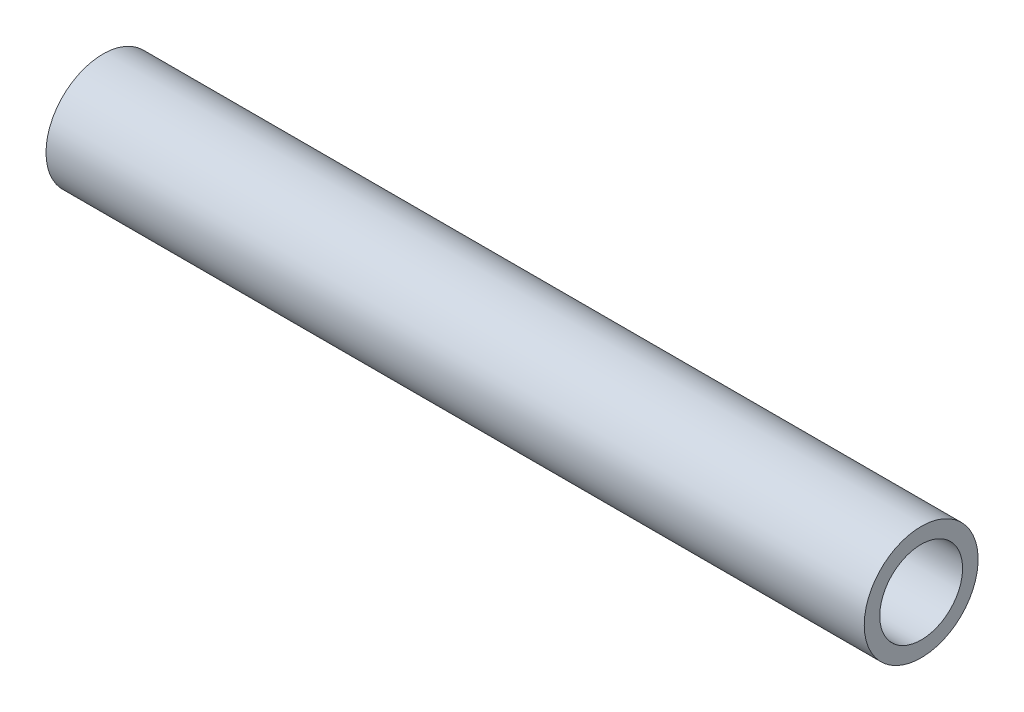
ISO-10303-21;
HEADER;
FILE_DESCRIPTION(('STEP AP214'),'2;1');
FILE_NAME('part.step','',(''),(''),'','','');
FILE_SCHEMA(('AUTOMOTIVE_DESIGN { 1 0 10303 214 1 1 1 1 }'));
ENDSEC;
DATA;
#1=APPLICATION_CONTEXT('core data for automotive mechanical design processes');
#2=APPLICATION_PROTOCOL_DEFINITION('international standard','automotive_design',2000,#1);
#3=PRODUCT_CONTEXT('',#1,'mechanical');
#4=PRODUCT('Part','Part','',(#3));
#5=PRODUCT_RELATED_PRODUCT_CATEGORY('part','',(#4));
#6=PRODUCT_DEFINITION_FORMATION('','',#4);
#7=PRODUCT_DEFINITION_CONTEXT('part definition',#1,'design');
#8=PRODUCT_DEFINITION('design','',#6,#7);
#9=PRODUCT_DEFINITION_SHAPE('','',#8);
#10=(LENGTH_UNIT() NAMED_UNIT(*) SI_UNIT(.MILLI.,.METRE.));
#11=(NAMED_UNIT(*) PLANE_ANGLE_UNIT() SI_UNIT($,.RADIAN.));
#12=(NAMED_UNIT(*) SI_UNIT($,.STERADIAN.) SOLID_ANGLE_UNIT());
#13=UNCERTAINTY_MEASURE_WITH_UNIT(LENGTH_MEASURE(1.E-05),#10,'distance_accuracy_value','');
#14=(GEOMETRIC_REPRESENTATION_CONTEXT(3) GLOBAL_UNCERTAINTY_ASSIGNED_CONTEXT((#13)) GLOBAL_UNIT_ASSIGNED_CONTEXT((#10,
#11,#12)) REPRESENTATION_CONTEXT('',''));
#15=CARTESIAN_POINT('',(0.,0.,0.));
#16=DIRECTION('',(0.,0.,1.));
#17=DIRECTION('',(1.,0.,0.));
#18=AXIS2_PLACEMENT_3D('',#15,#16,#17);
#19=CARTESIAN_POINT('',(239.999999999998,0.,0.));
#20=DIRECTION('',(0.999999999999997,0.,0.));
#21=DIRECTION('',(0.,0.,-0.999999999999997));
#22=AXIS2_PLACEMENT_3D('',#19,#20,#21);
#23=PLANE('',#22);
#24=CARTESIAN_POINT('',(239.999999999998,0.,0.));
#25=DIRECTION('',(0.999999999999997,0.,0.));
#26=DIRECTION('',(0.,0.,-0.999999999999997));
#27=AXIS2_PLACEMENT_3D('',#24,#25,#26);
#28=CIRCLE('',#27,16.7);
#29=CARTESIAN_POINT('',(239.999999999998,1.01779695782511E-13,16.6999999999999));
#30=VERTEX_POINT('',#29);
#31=EDGE_CURVE('E10',#30,#30,#28,.T.);
#32=ORIENTED_EDGE('',*,*,#31,.T.);
#33=EDGE_LOOP('',(#32));
#34=FACE_BOUND('',#33,.T.);
#35=CARTESIAN_POINT('',(239.999999999998,0.,0.));
#36=DIRECTION('',(0.999999999999997,0.,0.));
#37=DIRECTION('',(0.,0.,-0.999999999999997));
#38=AXIS2_PLACEMENT_3D('',#35,#36,#37);
#39=CIRCLE('',#38,12.15);
#40=CARTESIAN_POINT('',(239.999999999998,1.00516817092E-13,12.1499999999999));
#41=VERTEX_POINT('',#40);
#42=EDGE_CURVE('E39',#41,#41,#39,.T.);
#43=ORIENTED_EDGE('',*,*,#42,.F.);
#44=EDGE_LOOP('',(#43));
#45=FACE_BOUND('',#44,.T.);
#46=ADVANCED_FACE('F28',(#34,#45),#23,.T.);
#47=CARTESIAN_POINT('',(0.,0.,0.));
#48=DIRECTION('',(0.999999999999997,0.,0.));
#49=DIRECTION('',(0.,0.,-0.999999999999997));
#50=AXIS2_PLACEMENT_3D('',#47,#48,#49);
#51=PLANE('',#50);
#52=CARTESIAN_POINT('',(0.,0.,0.));
#53=DIRECTION('',(0.999999999999997,0.,0.));
#54=DIRECTION('',(0.,0.,-0.999999999999997));
#55=AXIS2_PLACEMENT_3D('',#52,#53,#54);
#56=CIRCLE('',#55,16.7);
#57=CARTESIAN_POINT('',(0.,1.01779695782513E-13,16.6999999999999));
#58=VERTEX_POINT('',#57);
#59=EDGE_CURVE('E32',#58,#58,#56,.T.);
#60=ORIENTED_EDGE('',*,*,#59,.F.);
#61=EDGE_LOOP('',(#60));
#62=FACE_BOUND('',#61,.T.);
#63=CARTESIAN_POINT('',(0.,0.,0.));
#64=DIRECTION('',(0.999999999999997,0.,0.));
#65=DIRECTION('',(0.,0.,-0.999999999999997));
#66=AXIS2_PLACEMENT_3D('',#63,#64,#65);
#67=CIRCLE('',#66,12.15);
#68=CARTESIAN_POINT('',(0.,1.00516817092002E-13,12.1499999999999));
#69=VERTEX_POINT('',#68);
#70=EDGE_CURVE('E41',#69,#69,#67,.T.);
#71=ORIENTED_EDGE('',*,*,#70,.T.);
#72=EDGE_LOOP('',(#71));
#73=FACE_BOUND('',#72,.T.);
#74=ADVANCED_FACE('F51',(#62,#73),#51,.F.);
#75=CARTESIAN_POINT('',(239.999999999998,0.,0.));
#76=DIRECTION('',(-0.999999999999997,0.,0.));
#77=DIRECTION('',(0.,0.,0.999999999999997));
#78=AXIS2_PLACEMENT_3D('',#75,#76,#77);
#79=CYLINDRICAL_SURFACE('',#78,16.7);
#80=CARTESIAN_POINT('',(239.999999999998,1.01779695782511E-13,16.6999999999999));
#81=CARTESIAN_POINT('',(237.499999999998,1.01779695782511E-13,16.6999999999999));
#82=CARTESIAN_POINT('',(234.999999999998,1.01779695782511E-13,16.6999999999999));
#83=CARTESIAN_POINT('',(229.999999999999,1.01779695782511E-13,16.6999999999999));
#84=CARTESIAN_POINT('',(227.499999999999,1.01779695782511E-13,16.6999999999999));
#85=CARTESIAN_POINT('',(222.499999999999,1.01779695782511E-13,16.6999999999999));
#86=CARTESIAN_POINT('',(219.999999999999,1.01779695782511E-13,16.6999999999999));
#87=CARTESIAN_POINT('',(214.999999999999,1.01779695782511E-13,16.6999999999999));
#88=CARTESIAN_POINT('',(212.499999999999,1.01779695782511E-13,16.6999999999999));
#89=CARTESIAN_POINT('',(207.499999999999,1.01779695782511E-13,16.6999999999999));
#90=CARTESIAN_POINT('',(204.999999999999,1.01779695782511E-13,16.6999999999999));
#91=CARTESIAN_POINT('',(199.999999999999,1.01779695782512E-13,16.6999999999999));
#92=CARTESIAN_POINT('',(197.499999999999,1.01779695782512E-13,16.6999999999999));
#93=CARTESIAN_POINT('',(192.499999999999,1.01779695782512E-13,16.6999999999999));
#94=CARTESIAN_POINT('',(189.999999999999,1.01779695782512E-13,16.6999999999999));
#95=CARTESIAN_POINT('',(184.999999999999,1.01779695782512E-13,16.6999999999999));
#96=CARTESIAN_POINT('',(182.499999999999,1.01779695782512E-13,16.6999999999999));
#97=CARTESIAN_POINT('',(177.499999999999,1.01779695782512E-13,16.6999999999999));
#98=CARTESIAN_POINT('',(174.999999999999,1.01779695782512E-13,16.6999999999999));
#99=CARTESIAN_POINT('',(169.999999999999,1.01779695782512E-13,16.6999999999999));
#100=CARTESIAN_POINT('',(167.499999999999,1.01779695782512E-13,16.6999999999999));
#101=CARTESIAN_POINT('',(162.499999999999,1.01779695782512E-13,16.6999999999999));
#102=CARTESIAN_POINT('',(159.999999999999,1.01779695782512E-13,16.6999999999999));
#103=CARTESIAN_POINT('',(154.999999999999,1.01779695782512E-13,16.6999999999999));
#104=CARTESIAN_POINT('',(152.499999999999,1.01779695782512E-13,16.6999999999999));
#105=CARTESIAN_POINT('',(147.499999999999,1.01779695782512E-13,16.6999999999999));
#106=CARTESIAN_POINT('',(144.999999999999,1.01779695782512E-13,16.6999999999999));
#107=CARTESIAN_POINT('',(139.999999999999,1.01779695782512E-13,16.6999999999999));
#108=CARTESIAN_POINT('',(137.499999999999,1.01779695782512E-13,16.6999999999999));
#109=CARTESIAN_POINT('',(132.499999999999,1.01779695782512E-13,16.6999999999999));
#110=CARTESIAN_POINT('',(129.999999999999,1.01779695782512E-13,16.6999999999999));
#111=CARTESIAN_POINT('',(124.999999999999,1.01779695782512E-13,16.6999999999999));
#112=CARTESIAN_POINT('',(122.499999999999,1.01779695782512E-13,16.6999999999999));
#113=CARTESIAN_POINT('',(117.499999999999,1.01779695782512E-13,16.6999999999999));
#114=CARTESIAN_POINT('',(114.999999999999,1.01779695782512E-13,16.6999999999999));
#115=CARTESIAN_POINT('',(109.999999999999,1.01779695782512E-13,16.6999999999999));
#116=CARTESIAN_POINT('',(107.499999999999,1.01779695782512E-13,16.6999999999999));
#117=CARTESIAN_POINT('',(102.499999999999,1.01779695782512E-13,16.6999999999999));
#118=CARTESIAN_POINT('',(99.9999999999993,1.01779695782512E-13,16.6999999999999));
#119=CARTESIAN_POINT('',(94.9999999999993,1.01779695782512E-13,16.6999999999999));
#120=CARTESIAN_POINT('',(92.4999999999994,1.01779695782512E-13,16.6999999999999));
#121=CARTESIAN_POINT('',(87.4999999999994,1.01779695782512E-13,16.6999999999999));
#122=CARTESIAN_POINT('',(84.9999999999994,1.01779695782512E-13,16.6999999999999));
#123=CARTESIAN_POINT('',(79.9999999999994,1.01779695782512E-13,16.6999999999999));
#124=CARTESIAN_POINT('',(77.4999999999994,1.01779695782512E-13,16.6999999999999));
#125=CARTESIAN_POINT('',(72.4999999999995,1.01779695782512E-13,16.6999999999999));
#126=CARTESIAN_POINT('',(69.9999999999995,1.01779695782512E-13,16.6999999999999));
#127=CARTESIAN_POINT('',(64.9999999999995,1.01779695782512E-13,16.6999999999999));
#128=CARTESIAN_POINT('',(62.4999999999996,1.01779695782512E-13,16.6999999999999));
#129=CARTESIAN_POINT('',(57.4999999999996,1.01779695782513E-13,16.6999999999999));
#130=CARTESIAN_POINT('',(54.9999999999996,1.01779695782513E-13,16.6999999999999));
#131=CARTESIAN_POINT('',(49.9999999999997,1.01779695782513E-13,16.6999999999999));
#132=CARTESIAN_POINT('',(47.4999999999997,1.01779695782513E-13,16.6999999999999));
#133=CARTESIAN_POINT('',(42.4999999999997,1.01779695782513E-13,16.6999999999999));
#134=CARTESIAN_POINT('',(39.9999999999997,1.01779695782513E-13,16.6999999999999));
#135=CARTESIAN_POINT('',(34.9999999999997,1.01779695782513E-13,16.6999999999999));
#136=CARTESIAN_POINT('',(32.4999999999998,1.01779695782513E-13,16.6999999999999));
#137=CARTESIAN_POINT('',(27.4999999999998,1.01779695782513E-13,16.6999999999999));
#138=CARTESIAN_POINT('',(24.9999999999998,1.01779695782513E-13,16.6999999999999));
#139=CARTESIAN_POINT('',(19.9999999999998,1.01779695782513E-13,16.6999999999999));
#140=CARTESIAN_POINT('',(17.4999999999999,1.01779695782513E-13,16.6999999999999));
#141=CARTESIAN_POINT('',(12.4999999999999,1.01779695782513E-13,16.6999999999999));
#142=CARTESIAN_POINT('',(9.99999999999991,1.01779695782513E-13,16.6999999999999));
#143=CARTESIAN_POINT('',(4.99999999999994,1.01779695782513E-13,16.6999999999999));
#144=CARTESIAN_POINT('',(2.49999999999996,1.01779695782513E-13,16.6999999999999));
#145=CARTESIAN_POINT('',(0.,1.01779695782513E-13,16.6999999999999));
#146=B_SPLINE_CURVE_WITH_KNOTS('',3,(#80,#81,#82,#83,#84,#85,#86,#87,#88,#89,#90,#91,#92,#93,
#94,#95,#96,#97,#98,#99,#100,#101,#102,#103,#104,#105,#106,#107,#108,#109,#110,#111,#112,#113,
#114,#115,#116,#117,#118,#119,#120,#121,#122,#123,#124,#125,#126,#127,#128,#129,#130,#131,#132,
#133,#134,#135,#136,#137,#138,#139,#140,#141,#142,#143,#144,#145),.UNSPECIFIED.,.F.,.F.,(4,2,2,
2,2,2,2,2,2,2,2,2,2,2,2,2,2,2,2,2,2,2,2,2,2,2,2,2,2,2,2,2,4),(0.,7.49999999999992,
14.9999999999999,22.4999999999998,29.9999999999998,37.4999999999997,44.9999999999997,
52.4999999999996,59.9999999999996,67.4999999999995,74.9999999999995,82.4999999999995,
89.9999999999994,97.4999999999993,104.999999999999,112.499999999999,119.999999999999,
127.499999999999,134.999999999999,142.499999999999,149.999999999999,157.499999999999,
164.999999999999,172.499999999999,179.999999999999,187.499999999999,194.999999999999,
202.499999999999,209.999999999999,217.499999999999,224.999999999999,232.499999999998,
239.999999999998),.UNSPECIFIED.);
#147=EDGE_CURVE('BSEAM30',#30,#58,#146,.T.);
#148=ORIENTED_EDGE('',*,*,#31,.F.);
#149=ORIENTED_EDGE('',*,*,#59,.T.);
#150=ORIENTED_EDGE('',*,*,#147,.T.);
#151=ORIENTED_EDGE('',*,*,#147,.F.);
#152=EDGE_LOOP('',(#148,#150,#149,#151));
#153=FACE_BOUND('',#152,.T.);
#154=ADVANCED_FACE('F30',(#153),#79,.T.);
#155=CARTESIAN_POINT('',(239.999999999998,0.,0.));
#156=DIRECTION('',(-0.999999999999997,0.,0.));
#157=DIRECTION('',(0.,0.,0.999999999999997));
#158=AXIS2_PLACEMENT_3D('',#155,#156,#157);
#159=CYLINDRICAL_SURFACE('',#158,12.15);
#160=CARTESIAN_POINT('',(239.999999999998,1.00516817092E-13,12.1499999999999));
#161=CARTESIAN_POINT('',(237.499999999998,1.00516817092E-13,12.1499999999999));
#162=CARTESIAN_POINT('',(234.999999999998,1.00516817092E-13,12.1499999999999));
#163=CARTESIAN_POINT('',(229.999999999999,1.00516817092E-13,12.1499999999999));
#164=CARTESIAN_POINT('',(227.499999999999,1.00516817092E-13,12.1499999999999));
#165=CARTESIAN_POINT('',(222.499999999999,1.00516817092E-13,12.1499999999999));
#166=CARTESIAN_POINT('',(219.999999999999,1.00516817092E-13,12.1499999999999));
#167=CARTESIAN_POINT('',(214.999999999999,1.00516817092E-13,12.1499999999999));
#168=CARTESIAN_POINT('',(212.499999999999,1.00516817092E-13,12.1499999999999));
#169=CARTESIAN_POINT('',(207.499999999999,1.00516817092E-13,12.1499999999999));
#170=CARTESIAN_POINT('',(204.999999999999,1.00516817092E-13,12.1499999999999));
#171=CARTESIAN_POINT('',(199.999999999999,1.00516817092E-13,12.1499999999999));
#172=CARTESIAN_POINT('',(197.499999999999,1.00516817092E-13,12.1499999999999));
#173=CARTESIAN_POINT('',(192.499999999999,1.00516817092E-13,12.1499999999999));
#174=CARTESIAN_POINT('',(189.999999999999,1.00516817092E-13,12.1499999999999));
#175=CARTESIAN_POINT('',(184.999999999999,1.00516817092001E-13,12.1499999999999));
#176=CARTESIAN_POINT('',(182.499999999999,1.00516817092001E-13,12.1499999999999));
#177=CARTESIAN_POINT('',(177.499999999999,1.00516817092001E-13,12.1499999999999));
#178=CARTESIAN_POINT('',(174.999999999999,1.00516817092001E-13,12.1499999999999));
#179=CARTESIAN_POINT('',(169.999999999999,1.00516817092001E-13,12.1499999999999));
#180=CARTESIAN_POINT('',(167.499999999999,1.00516817092001E-13,12.1499999999999));
#181=CARTESIAN_POINT('',(162.499999999999,1.00516817092001E-13,12.1499999999999));
#182=CARTESIAN_POINT('',(159.999999999999,1.00516817092001E-13,12.1499999999999));
#183=CARTESIAN_POINT('',(154.999999999999,1.00516817092001E-13,12.1499999999999));
#184=CARTESIAN_POINT('',(152.499999999999,1.00516817092001E-13,12.1499999999999));
#185=CARTESIAN_POINT('',(147.499999999999,1.00516817092001E-13,12.1499999999999));
#186=CARTESIAN_POINT('',(144.999999999999,1.00516817092001E-13,12.1499999999999));
#187=CARTESIAN_POINT('',(139.999999999999,1.00516817092001E-13,12.1499999999999));
#188=CARTESIAN_POINT('',(137.499999999999,1.00516817092001E-13,12.1499999999999));
#189=CARTESIAN_POINT('',(132.499999999999,1.00516817092001E-13,12.1499999999999));
#190=CARTESIAN_POINT('',(129.999999999999,1.00516817092001E-13,12.1499999999999));
#191=CARTESIAN_POINT('',(124.999999999999,1.00516817092001E-13,12.1499999999999));
#192=CARTESIAN_POINT('',(122.499999999999,1.00516817092001E-13,12.1499999999999));
#193=CARTESIAN_POINT('',(117.499999999999,1.00516817092001E-13,12.1499999999999));
#194=CARTESIAN_POINT('',(114.999999999999,1.00516817092001E-13,12.1499999999999));
#195=CARTESIAN_POINT('',(109.999999999999,1.00516817092001E-13,12.1499999999999));
#196=CARTESIAN_POINT('',(107.499999999999,1.00516817092001E-13,12.1499999999999));
#197=CARTESIAN_POINT('',(102.499999999999,1.00516817092001E-13,12.1499999999999));
#198=CARTESIAN_POINT('',(99.9999999999993,1.00516817092001E-13,12.1499999999999));
#199=CARTESIAN_POINT('',(94.9999999999993,1.00516817092001E-13,12.1499999999999));
#200=CARTESIAN_POINT('',(92.4999999999994,1.00516817092001E-13,12.1499999999999));
#201=CARTESIAN_POINT('',(87.4999999999994,1.00516817092001E-13,12.1499999999999));
#202=CARTESIAN_POINT('',(84.9999999999994,1.00516817092001E-13,12.1499999999999));
#203=CARTESIAN_POINT('',(79.9999999999994,1.00516817092001E-13,12.1499999999999));
#204=CARTESIAN_POINT('',(77.4999999999994,1.00516817092001E-13,12.1499999999999));
#205=CARTESIAN_POINT('',(72.4999999999995,1.00516817092001E-13,12.1499999999999));
#206=CARTESIAN_POINT('',(69.9999999999995,1.00516817092001E-13,12.1499999999999));
#207=CARTESIAN_POINT('',(64.9999999999995,1.00516817092001E-13,12.1499999999999));
#208=CARTESIAN_POINT('',(62.4999999999996,1.00516817092001E-13,12.1499999999999));
#209=CARTESIAN_POINT('',(57.4999999999996,1.00516817092001E-13,12.1499999999999));
#210=CARTESIAN_POINT('',(54.9999999999996,1.00516817092001E-13,12.1499999999999));
#211=CARTESIAN_POINT('',(49.9999999999997,1.00516817092001E-13,12.1499999999999));
#212=CARTESIAN_POINT('',(47.4999999999997,1.00516817092001E-13,12.1499999999999));
#213=CARTESIAN_POINT('',(42.4999999999997,1.00516817092002E-13,12.1499999999999));
#214=CARTESIAN_POINT('',(39.9999999999997,1.00516817092002E-13,12.1499999999999));
#215=CARTESIAN_POINT('',(34.9999999999997,1.00516817092002E-13,12.1499999999999));
#216=CARTESIAN_POINT('',(32.4999999999998,1.00516817092002E-13,12.1499999999999));
#217=CARTESIAN_POINT('',(27.4999999999998,1.00516817092002E-13,12.1499999999999));
#218=CARTESIAN_POINT('',(24.9999999999998,1.00516817092002E-13,12.1499999999999));
#219=CARTESIAN_POINT('',(19.9999999999998,1.00516817092002E-13,12.1499999999999));
#220=CARTESIAN_POINT('',(17.4999999999999,1.00516817092002E-13,12.1499999999999));
#221=CARTESIAN_POINT('',(12.4999999999999,1.00516817092002E-13,12.1499999999999));
#222=CARTESIAN_POINT('',(9.99999999999991,1.00516817092002E-13,12.1499999999999));
#223=CARTESIAN_POINT('',(4.99999999999994,1.00516817092002E-13,12.1499999999999));
#224=CARTESIAN_POINT('',(2.49999999999996,1.00516817092002E-13,12.1499999999999));
#225=CARTESIAN_POINT('',(0.,1.00516817092002E-13,12.1499999999999));
#226=B_SPLINE_CURVE_WITH_KNOTS('',3,(#160,#161,#162,#163,#164,#165,#166,#167,#168,#169,#170,
#171,#172,#173,#174,#175,#176,#177,#178,#179,#180,#181,#182,#183,#184,#185,#186,#187,#188,#189,
#190,#191,#192,#193,#194,#195,#196,#197,#198,#199,#200,#201,#202,#203,#204,#205,#206,#207,#208,
#209,#210,#211,#212,#213,#214,#215,#216,#217,#218,#219,#220,#221,#222,#223,#224,#225),
.UNSPECIFIED.,.F.,.F.,(4,2,2,2,2,2,2,2,2,2,2,2,2,2,2,2,2,2,2,2,2,2,2,2,2,2,2,2,2,2,2,2,4),(0.,
7.49999999999992,14.9999999999999,22.4999999999998,29.9999999999998,37.4999999999997,
44.9999999999997,52.4999999999996,59.9999999999996,67.4999999999995,74.9999999999995,
82.4999999999995,89.9999999999994,97.4999999999993,104.999999999999,112.499999999999,
119.999999999999,127.499999999999,134.999999999999,142.499999999999,149.999999999999,
157.499999999999,164.999999999999,172.499999999999,179.999999999999,187.499999999999,
194.999999999999,202.499999999999,209.999999999999,217.499999999999,224.999999999999,
232.499999999998,239.999999999998),.UNSPECIFIED.);
#227=EDGE_CURVE('BSEAM47',#41,#69,#226,.T.);
#228=ORIENTED_EDGE('',*,*,#42,.T.);
#229=ORIENTED_EDGE('',*,*,#70,.F.);
#230=ORIENTED_EDGE('',*,*,#227,.T.);
#231=ORIENTED_EDGE('',*,*,#227,.F.);
#232=EDGE_LOOP('',(#228,#230,#229,#231));
#233=FACE_BOUND('',#232,.T.);
#234=ADVANCED_FACE('F47',(#233),#159,.F.);
#235=CLOSED_SHELL('',(#46,#74,#154,#234));
#236=MANIFOLD_SOLID_BREP('B2',#235);
#237=ADVANCED_BREP_SHAPE_REPRESENTATION('',(#18,#236),#14);
#238=SHAPE_DEFINITION_REPRESENTATION(#9,#237);
ENDSEC;
END-ISO-10303-21;
